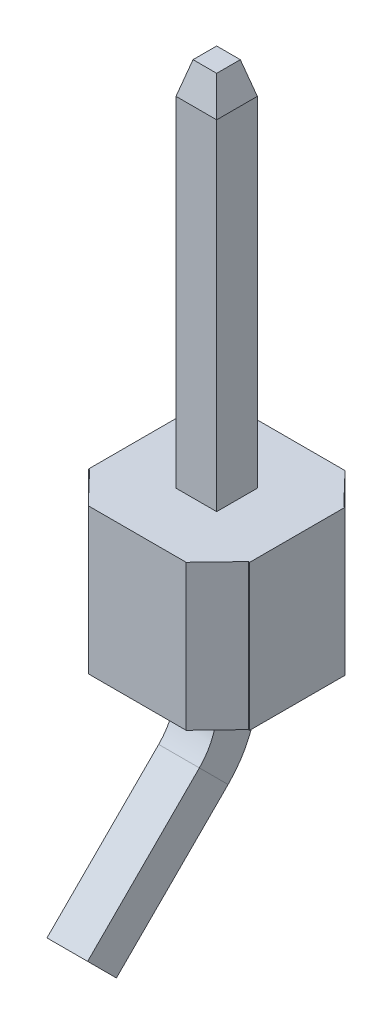
ISO-10303-21;
HEADER;
FILE_DESCRIPTION(('STEP AP214'),'2;1');
FILE_NAME('part.step','',(''),(''),'','','');
FILE_SCHEMA(('AUTOMOTIVE_DESIGN { 1 0 10303 214 1 1 1 1 }'));
ENDSEC;
DATA;
#1=APPLICATION_CONTEXT('core data for automotive mechanical design processes');
#2=APPLICATION_PROTOCOL_DEFINITION('international standard','automotive_design',2000,#1);
#3=PRODUCT_CONTEXT('',#1,'mechanical');
#4=PRODUCT('Part','Part','',(#3));
#5=PRODUCT_RELATED_PRODUCT_CATEGORY('part','',(#4));
#6=PRODUCT_DEFINITION_FORMATION('','',#4);
#7=PRODUCT_DEFINITION_CONTEXT('part definition',#1,'design');
#8=PRODUCT_DEFINITION('design','',#6,#7);
#9=PRODUCT_DEFINITION_SHAPE('','',#8);
#10=(LENGTH_UNIT() NAMED_UNIT(*) SI_UNIT(.MILLI.,.METRE.));
#11=(NAMED_UNIT(*) PLANE_ANGLE_UNIT() SI_UNIT($,.RADIAN.));
#12=(NAMED_UNIT(*) SI_UNIT($,.STERADIAN.) SOLID_ANGLE_UNIT());
#13=UNCERTAINTY_MEASURE_WITH_UNIT(LENGTH_MEASURE(1.E-05),#10,'distance_accuracy_value','');
#14=(GEOMETRIC_REPRESENTATION_CONTEXT(3) GLOBAL_UNCERTAINTY_ASSIGNED_CONTEXT((#13)) GLOBAL_UNIT_ASSIGNED_CONTEXT((#10,
#11,#12)) REPRESENTATION_CONTEXT('',''));
#15=CARTESIAN_POINT('',(0.,0.,0.));
#16=DIRECTION('',(0.,0.,1.));
#17=DIRECTION('',(1.,0.,0.));
#18=AXIS2_PLACEMENT_3D('',#15,#16,#17);
#19=CARTESIAN_POINT('',(0.,2.29,0.));
#20=DIRECTION('',(0.,-1.,0.));
#21=DIRECTION('',(0.,0.,-1.));
#22=AXIS2_PLACEMENT_3D('',#19,#20,#21);
#23=PLANE('',#22);
#24=DIRECTION('',(-0.692531828189713,0.,0.721387321030952));
#25=VECTOR('',#24,1.);
#26=CARTESIAN_POINT('',(-0.770000000000001,2.29,-1.25));
#27=LINE('',#26,#25);
#28=CARTESIAN_POINT('',(-0.770000000000001,2.29,-1.25));
#29=VERTEX_POINT('',#28);
#30=CARTESIAN_POINT('',(-1.25,2.29,-0.749999999999999));
#31=VERTEX_POINT('',#30);
#32=EDGE_CURVE('E313',#29,#31,#27,.T.);
#33=ORIENTED_EDGE('',*,*,#32,.T.);
#34=DIRECTION('',(-1.,0.,0.));
#35=VECTOR('',#34,1.);
#36=CARTESIAN_POINT('',(-1.25,2.29,-0.749999999999999));
#37=LINE('',#36,#35);
#38=CARTESIAN_POINT('',(-1.27,2.29,-0.749999999999999));
#39=VERTEX_POINT('',#38);
#40=EDGE_CURVE('E316',#31,#39,#37,.T.);
#41=ORIENTED_EDGE('',*,*,#40,.T.);
#42=DIRECTION('',(0.,0.,1.));
#43=VECTOR('',#42,1.);
#44=CARTESIAN_POINT('',(-1.27,2.29,0.75));
#45=LINE('',#44,#43);
#46=CARTESIAN_POINT('',(-1.27,2.29,0.75));
#47=VERTEX_POINT('',#46);
#48=EDGE_CURVE('E319',#39,#47,#45,.T.);
#49=ORIENTED_EDGE('',*,*,#48,.T.);
#50=DIRECTION('',(1.,0.,0.));
#51=VECTOR('',#50,1.);
#52=CARTESIAN_POINT('',(-1.25,2.29,0.75));
#53=LINE('',#52,#51);
#54=CARTESIAN_POINT('',(-1.25,2.29,0.75));
#55=VERTEX_POINT('',#54);
#56=EDGE_CURVE('E321',#47,#55,#53,.T.);
#57=ORIENTED_EDGE('',*,*,#56,.T.);
#58=DIRECTION('',(0.692531828189713,0.,0.721387321030951));
#59=VECTOR('',#58,1.);
#60=CARTESIAN_POINT('',(-0.77,2.29,1.25));
#61=LINE('',#60,#59);
#62=CARTESIAN_POINT('',(-0.77,2.29,1.25));
#63=VERTEX_POINT('',#62);
#64=EDGE_CURVE('E323',#55,#63,#61,.T.);
#65=ORIENTED_EDGE('',*,*,#64,.T.);
#66=DIRECTION('',(1.,0.,0.));
#67=VECTOR('',#66,1.);
#68=CARTESIAN_POINT('',(-0.77,2.29,1.25));
#69=LINE('',#68,#67);
#70=CARTESIAN_POINT('',(0.77,2.29,1.25));
#71=VERTEX_POINT('',#70);
#72=EDGE_CURVE('E325',#63,#71,#69,.T.);
#73=ORIENTED_EDGE('',*,*,#72,.T.);
#74=DIRECTION('',(0.692531828189713,0.,-0.721387321030952));
#75=VECTOR('',#74,1.);
#76=CARTESIAN_POINT('',(0.77,2.29,1.25));
#77=LINE('',#76,#75);
#78=CARTESIAN_POINT('',(1.25,2.29,0.749999999999999));
#79=VERTEX_POINT('',#78);
#80=EDGE_CURVE('E327',#71,#79,#77,.T.);
#81=ORIENTED_EDGE('',*,*,#80,.T.);
#82=DIRECTION('',(1.,0.,0.));
#83=VECTOR('',#82,1.);
#84=CARTESIAN_POINT('',(1.25,2.29,0.749999999999999));
#85=LINE('',#84,#83);
#86=CARTESIAN_POINT('',(1.27,2.29,0.749999999999999));
#87=VERTEX_POINT('',#86);
#88=EDGE_CURVE('E329',#79,#87,#85,.T.);
#89=ORIENTED_EDGE('',*,*,#88,.T.);
#90=DIRECTION('',(0.,0.,-1.));
#91=VECTOR('',#90,1.);
#92=CARTESIAN_POINT('',(1.27,2.29,0.749999999999999));
#93=LINE('',#92,#91);
#94=CARTESIAN_POINT('',(1.27,2.29,-0.749999999999999));
#95=VERTEX_POINT('',#94);
#96=EDGE_CURVE('E331',#87,#95,#93,.T.);
#97=ORIENTED_EDGE('',*,*,#96,.T.);
#98=DIRECTION('',(-1.,0.,0.));
#99=VECTOR('',#98,1.);
#100=CARTESIAN_POINT('',(1.25,2.29,-0.749999999999999));
#101=LINE('',#100,#99);
#102=CARTESIAN_POINT('',(1.25,2.29,-0.749999999999999));
#103=VERTEX_POINT('',#102);
#104=EDGE_CURVE('E333',#95,#103,#101,.T.);
#105=ORIENTED_EDGE('',*,*,#104,.T.);
#106=DIRECTION('',(-0.692531828189713,0.,-0.721387321030952));
#107=VECTOR('',#106,1.);
#108=CARTESIAN_POINT('',(0.77,2.29,-1.25));
#109=LINE('',#108,#107);
#110=CARTESIAN_POINT('',(0.77,2.29,-1.25));
#111=VERTEX_POINT('',#110);
#112=EDGE_CURVE('E335',#103,#111,#109,.T.);
#113=ORIENTED_EDGE('',*,*,#112,.T.);
#114=DIRECTION('',(-1.,0.,0.));
#115=VECTOR('',#114,1.);
#116=CARTESIAN_POINT('',(-0.770000000000001,2.29,-1.25));
#117=LINE('',#116,#115);
#118=EDGE_CURVE('E337',#111,#29,#117,.T.);
#119=ORIENTED_EDGE('',*,*,#118,.T.);
#120=EDGE_LOOP('',(#33,#41,#49,#57,#65,#73,#81,#89,#97,#105,#113,#119));
#121=FACE_BOUND('',#120,.T.);
#122=DIRECTION('',(0.,0.,1.));
#123=VECTOR('',#122,1.);
#124=CARTESIAN_POINT('',(-0.32,2.29,0.));
#125=LINE('',#124,#123);
#126=CARTESIAN_POINT('',(-0.32,2.29,-0.320000000000002));
#127=VERTEX_POINT('',#126);
#128=CARTESIAN_POINT('',(-0.32,2.29,0.319999999999999));
#129=VERTEX_POINT('',#128);
#130=EDGE_CURVE('E309',#127,#129,#125,.T.);
#131=ORIENTED_EDGE('',*,*,#130,.F.);
#132=DIRECTION('',(-1.,0.,0.));
#133=VECTOR('',#132,1.);
#134=CARTESIAN_POINT('',(0.,2.29,-0.320000000000002));
#135=LINE('',#134,#133);
#136=CARTESIAN_POINT('',(0.32,2.29,-0.320000000000002));
#137=VERTEX_POINT('',#136);
#138=EDGE_CURVE('E300',#137,#127,#135,.T.);
#139=ORIENTED_EDGE('',*,*,#138,.F.);
#140=DIRECTION('',(0.,0.,-1.));
#141=VECTOR('',#140,1.);
#142=CARTESIAN_POINT('',(0.32,2.29,0.));
#143=LINE('',#142,#141);
#144=CARTESIAN_POINT('',(0.32,2.29,0.32));
#145=VERTEX_POINT('',#144);
#146=EDGE_CURVE('E303',#145,#137,#143,.T.);
#147=ORIENTED_EDGE('',*,*,#146,.F.);
#148=DIRECTION('',(1.,0.,0.));
#149=VECTOR('',#148,1.);
#150=CARTESIAN_POINT('',(0.,2.29,0.319999999999999));
#151=LINE('',#150,#149);
#152=EDGE_CURVE('E306',#129,#145,#151,.T.);
#153=ORIENTED_EDGE('',*,*,#152,.F.);
#154=EDGE_LOOP('',(#131,#139,#147,#153));
#155=FACE_BOUND('',#154,.T.);
#156=ADVANCED_FACE('F37',(#121,#155),#23,.F.);
#157=CARTESIAN_POINT('',(0.,0.,0.));
#158=DIRECTION('',(0.,-1.,0.));
#159=DIRECTION('',(0.,0.,-1.));
#160=AXIS2_PLACEMENT_3D('',#157,#158,#159);
#161=PLANE('',#160);
#162=DIRECTION('',(-0.692531828189713,0.,0.721387321030952));
#163=VECTOR('',#162,1.);
#164=CARTESIAN_POINT('',(-0.770000000000001,0.,-1.25));
#165=LINE('',#164,#163);
#166=CARTESIAN_POINT('',(-0.770000000000001,0.,-1.25));
#167=VERTEX_POINT('',#166);
#168=CARTESIAN_POINT('',(-1.25,0.,-0.749999999999999));
#169=VERTEX_POINT('',#168);
#170=EDGE_CURVE('E312',#167,#169,#165,.T.);
#171=ORIENTED_EDGE('',*,*,#170,.F.);
#172=DIRECTION('',(-1.,0.,0.));
#173=VECTOR('',#172,1.);
#174=CARTESIAN_POINT('',(-0.770000000000001,0.,-1.25));
#175=LINE('',#174,#173);
#176=CARTESIAN_POINT('',(0.77,0.,-1.25));
#177=VERTEX_POINT('',#176);
#178=EDGE_CURVE('E317',#177,#167,#175,.T.);
#179=ORIENTED_EDGE('',*,*,#178,.F.);
#180=DIRECTION('',(-0.692531828189713,0.,-0.721387321030952));
#181=VECTOR('',#180,1.);
#182=CARTESIAN_POINT('',(0.77,0.,-1.25));
#183=LINE('',#182,#181);
#184=CARTESIAN_POINT('',(1.25,0.,-0.749999999999999));
#185=VERTEX_POINT('',#184);
#186=EDGE_CURVE('E360',#185,#177,#183,.T.);
#187=ORIENTED_EDGE('',*,*,#186,.F.);
#188=DIRECTION('',(-1.,0.,0.));
#189=VECTOR('',#188,1.);
#190=CARTESIAN_POINT('',(1.25,0.,-0.749999999999999));
#191=LINE('',#190,#189);
#192=CARTESIAN_POINT('',(1.27,0.,-0.749999999999999));
#193=VERTEX_POINT('',#192);
#194=EDGE_CURVE('E358',#193,#185,#191,.T.);
#195=ORIENTED_EDGE('',*,*,#194,.F.);
#196=DIRECTION('',(0.,0.,-1.));
#197=VECTOR('',#196,1.);
#198=CARTESIAN_POINT('',(1.27,0.,0.749999999999999));
#199=LINE('',#198,#197);
#200=CARTESIAN_POINT('',(1.27,0.,0.749999999999999));
#201=VERTEX_POINT('',#200);
#202=EDGE_CURVE('E356',#201,#193,#199,.T.);
#203=ORIENTED_EDGE('',*,*,#202,.F.);
#204=DIRECTION('',(1.,0.,0.));
#205=VECTOR('',#204,1.);
#206=CARTESIAN_POINT('',(1.25,0.,0.749999999999999));
#207=LINE('',#206,#205);
#208=CARTESIAN_POINT('',(1.25,0.,0.749999999999999));
#209=VERTEX_POINT('',#208);
#210=EDGE_CURVE('E354',#209,#201,#207,.T.);
#211=ORIENTED_EDGE('',*,*,#210,.F.);
#212=DIRECTION('',(0.692531828189713,0.,-0.721387321030952));
#213=VECTOR('',#212,1.);
#214=CARTESIAN_POINT('',(0.77,0.,1.25));
#215=LINE('',#214,#213);
#216=CARTESIAN_POINT('',(0.77,0.,1.25));
#217=VERTEX_POINT('',#216);
#218=EDGE_CURVE('E352',#217,#209,#215,.T.);
#219=ORIENTED_EDGE('',*,*,#218,.F.);
#220=DIRECTION('',(1.,0.,0.));
#221=VECTOR('',#220,1.);
#222=CARTESIAN_POINT('',(-0.77,0.,1.25));
#223=LINE('',#222,#221);
#224=CARTESIAN_POINT('',(-0.77,0.,1.25));
#225=VERTEX_POINT('',#224);
#226=EDGE_CURVE('E350',#225,#217,#223,.T.);
#227=ORIENTED_EDGE('',*,*,#226,.F.);
#228=DIRECTION('',(0.692531828189713,0.,0.721387321030951));
#229=VECTOR('',#228,1.);
#230=CARTESIAN_POINT('',(-0.77,0.,1.25));
#231=LINE('',#230,#229);
#232=CARTESIAN_POINT('',(-1.25,0.,0.75));
#233=VERTEX_POINT('',#232);
#234=EDGE_CURVE('E348',#233,#225,#231,.T.);
#235=ORIENTED_EDGE('',*,*,#234,.F.);
#236=DIRECTION('',(1.,0.,0.));
#237=VECTOR('',#236,1.);
#238=CARTESIAN_POINT('',(-1.25,0.,0.75));
#239=LINE('',#238,#237);
#240=CARTESIAN_POINT('',(-1.27,0.,0.75));
#241=VERTEX_POINT('',#240);
#242=EDGE_CURVE('E346',#241,#233,#239,.T.);
#243=ORIENTED_EDGE('',*,*,#242,.F.);
#244=DIRECTION('',(0.,0.,1.));
#245=VECTOR('',#244,1.);
#246=CARTESIAN_POINT('',(-1.27,0.,0.75));
#247=LINE('',#246,#245);
#248=CARTESIAN_POINT('',(-1.27,0.,-0.749999999999999));
#249=VERTEX_POINT('',#248);
#250=EDGE_CURVE('E344',#249,#241,#247,.T.);
#251=ORIENTED_EDGE('',*,*,#250,.F.);
#252=DIRECTION('',(-1.,0.,0.));
#253=VECTOR('',#252,1.);
#254=CARTESIAN_POINT('',(-1.25,0.,-0.749999999999999));
#255=LINE('',#254,#253);
#256=EDGE_CURVE('E342',#169,#249,#255,.T.);
#257=ORIENTED_EDGE('',*,*,#256,.F.);
#258=EDGE_LOOP('',(#171,#179,#187,#195,#203,#211,#219,#227,#235,#243,#251,#257));
#259=FACE_BOUND('',#258,.T.);
#260=DIRECTION('',(-1.,0.,0.));
#261=VECTOR('',#260,1.);
#262=CARTESIAN_POINT('',(0.,0.,-0.320000000000002));
#263=LINE('',#262,#261);
#264=CARTESIAN_POINT('',(0.32,0.,-0.320000000000002));
#265=VERTEX_POINT('',#264);
#266=CARTESIAN_POINT('',(-0.32,0.,-0.320000000000002));
#267=VERTEX_POINT('',#266);
#268=EDGE_CURVE('E398',#265,#267,#263,.T.);
#269=ORIENTED_EDGE('',*,*,#268,.T.);
#270=DIRECTION('',(0.,0.,1.));
#271=VECTOR('',#270,1.);
#272=CARTESIAN_POINT('',(-0.32,0.,0.));
#273=LINE('',#272,#271);
#274=CARTESIAN_POINT('',(-0.32,0.,0.319999999999998));
#275=VERTEX_POINT('',#274);
#276=EDGE_CURVE('E219',#267,#275,#273,.T.);
#277=ORIENTED_EDGE('',*,*,#276,.T.);
#278=DIRECTION('',(1.,0.,0.));
#279=VECTOR('',#278,1.);
#280=CARTESIAN_POINT('',(0.,0.,0.319999999999998));
#281=LINE('',#280,#279);
#282=CARTESIAN_POINT('',(0.32,0.,0.319999999999998));
#283=VERTEX_POINT('',#282);
#284=EDGE_CURVE('E403',#275,#283,#281,.T.);
#285=ORIENTED_EDGE('',*,*,#284,.T.);
#286=DIRECTION('',(0.,0.,-1.));
#287=VECTOR('',#286,1.);
#288=CARTESIAN_POINT('',(0.32,0.,0.));
#289=LINE('',#288,#287);
#290=EDGE_CURVE('E400',#283,#265,#289,.T.);
#291=ORIENTED_EDGE('',*,*,#290,.T.);
#292=EDGE_LOOP('',(#269,#277,#285,#291));
#293=FACE_BOUND('',#292,.T.);
#294=ADVANCED_FACE('F464',(#259,#293),#161,.T.);
#295=CARTESIAN_POINT('',(-0.770000000000001,2.29,-1.25));
#296=DIRECTION('',(0.721387321030952,0.,0.692531828189713));
#297=DIRECTION('',(0.692531828189713,0.,-0.721387321030952));
#298=AXIS2_PLACEMENT_3D('',#295,#296,#297);
#299=PLANE('',#298);
#300=ORIENTED_EDGE('',*,*,#170,.T.);
#301=DIRECTION('',(0.,-1.,0.));
#302=VECTOR('',#301,1.);
#303=CARTESIAN_POINT('',(-1.25,2.29,-0.749999999999999));
#304=LINE('',#303,#302);
#305=EDGE_CURVE('E395',#31,#169,#304,.T.);
#306=ORIENTED_EDGE('',*,*,#305,.F.);
#307=ORIENTED_EDGE('',*,*,#32,.F.);
#308=DIRECTION('',(0.,-1.,0.));
#309=VECTOR('',#308,1.);
#310=CARTESIAN_POINT('',(-0.770000000000001,2.29,-1.25));
#311=LINE('',#310,#309);
#312=EDGE_CURVE('E339',#29,#167,#311,.T.);
#313=ORIENTED_EDGE('',*,*,#312,.T.);
#314=EDGE_LOOP('',(#300,#306,#307,#313));
#315=FACE_BOUND('',#314,.T.);
#316=ADVANCED_FACE('F469',(#315),#299,.F.);
#317=CARTESIAN_POINT('',(-1.25,2.29,-0.749999999999999));
#318=DIRECTION('',(0.,0.,1.));
#319=DIRECTION('',(1.,0.,0.));
#320=AXIS2_PLACEMENT_3D('',#317,#318,#319);
#321=PLANE('',#320);
#322=ORIENTED_EDGE('',*,*,#256,.T.);
#323=DIRECTION('',(0.,-1.,0.));
#324=VECTOR('',#323,1.);
#325=CARTESIAN_POINT('',(-1.27,2.29,-0.749999999999999));
#326=LINE('',#325,#324);
#327=EDGE_CURVE('E392',#39,#249,#326,.T.);
#328=ORIENTED_EDGE('',*,*,#327,.F.);
#329=ORIENTED_EDGE('',*,*,#40,.F.);
#330=ORIENTED_EDGE('',*,*,#305,.T.);
#331=EDGE_LOOP('',(#322,#328,#329,#330));
#332=FACE_BOUND('',#331,.T.);
#333=ADVANCED_FACE('F514',(#332),#321,.F.);
#334=CARTESIAN_POINT('',(-1.27,2.29,0.75));
#335=DIRECTION('',(1.,0.,0.));
#336=DIRECTION('',(0.,0.,-1.));
#337=AXIS2_PLACEMENT_3D('',#334,#335,#336);
#338=PLANE('',#337);
#339=ORIENTED_EDGE('',*,*,#250,.T.);
#340=DIRECTION('',(0.,-1.,0.));
#341=VECTOR('',#340,1.);
#342=CARTESIAN_POINT('',(-1.27,2.29,0.75));
#343=LINE('',#342,#341);
#344=EDGE_CURVE('E389',#47,#241,#343,.T.);
#345=ORIENTED_EDGE('',*,*,#344,.F.);
#346=ORIENTED_EDGE('',*,*,#48,.F.);
#347=ORIENTED_EDGE('',*,*,#327,.T.);
#348=EDGE_LOOP('',(#339,#345,#346,#347));
#349=FACE_BOUND('',#348,.T.);
#350=ADVANCED_FACE('F510',(#349),#338,.F.);
#351=CARTESIAN_POINT('',(-1.25,2.29,0.75));
#352=DIRECTION('',(0.,0.,-1.));
#353=DIRECTION('',(-1.,0.,0.));
#354=AXIS2_PLACEMENT_3D('',#351,#352,#353);
#355=PLANE('',#354);
#356=ORIENTED_EDGE('',*,*,#242,.T.);
#357=DIRECTION('',(0.,-1.,0.));
#358=VECTOR('',#357,1.);
#359=CARTESIAN_POINT('',(-1.25,2.29,0.75));
#360=LINE('',#359,#358);
#361=EDGE_CURVE('E386',#55,#233,#360,.T.);
#362=ORIENTED_EDGE('',*,*,#361,.F.);
#363=ORIENTED_EDGE('',*,*,#56,.F.);
#364=ORIENTED_EDGE('',*,*,#344,.T.);
#365=EDGE_LOOP('',(#356,#362,#363,#364));
#366=FACE_BOUND('',#365,.T.);
#367=ADVANCED_FACE('F506',(#366),#355,.F.);
#368=CARTESIAN_POINT('',(-0.77,2.29,1.25));
#369=DIRECTION('',(0.721387321030951,0.,-0.692531828189714));
#370=DIRECTION('',(-0.692531828189714,0.,-0.721387321030951));
#371=AXIS2_PLACEMENT_3D('',#368,#369,#370);
#372=PLANE('',#371);
#373=ORIENTED_EDGE('',*,*,#234,.T.);
#374=DIRECTION('',(0.,-1.,0.));
#375=VECTOR('',#374,1.);
#376=CARTESIAN_POINT('',(-0.77,2.29,1.25));
#377=LINE('',#376,#375);
#378=EDGE_CURVE('E383',#63,#225,#377,.T.);
#379=ORIENTED_EDGE('',*,*,#378,.F.);
#380=ORIENTED_EDGE('',*,*,#64,.F.);
#381=ORIENTED_EDGE('',*,*,#361,.T.);
#382=EDGE_LOOP('',(#373,#379,#380,#381));
#383=FACE_BOUND('',#382,.T.);
#384=ADVANCED_FACE('F502',(#383),#372,.F.);
#385=CARTESIAN_POINT('',(-0.77,2.29,1.25));
#386=DIRECTION('',(0.,0.,-1.));
#387=DIRECTION('',(-1.,0.,0.));
#388=AXIS2_PLACEMENT_3D('',#385,#386,#387);
#389=PLANE('',#388);
#390=ORIENTED_EDGE('',*,*,#226,.T.);
#391=DIRECTION('',(0.,-1.,0.));
#392=VECTOR('',#391,1.);
#393=CARTESIAN_POINT('',(0.77,2.29,1.25));
#394=LINE('',#393,#392);
#395=EDGE_CURVE('E380',#71,#217,#394,.T.);
#396=ORIENTED_EDGE('',*,*,#395,.F.);
#397=ORIENTED_EDGE('',*,*,#72,.F.);
#398=ORIENTED_EDGE('',*,*,#378,.T.);
#399=EDGE_LOOP('',(#390,#396,#397,#398));
#400=FACE_BOUND('',#399,.T.);
#401=ADVANCED_FACE('F498',(#400),#389,.F.);
#402=CARTESIAN_POINT('',(0.77,2.29,1.25));
#403=DIRECTION('',(-0.721387321030952,0.,-0.692531828189713));
#404=DIRECTION('',(-0.692531828189713,0.,0.721387321030952));
#405=AXIS2_PLACEMENT_3D('',#402,#403,#404);
#406=PLANE('',#405);
#407=ORIENTED_EDGE('',*,*,#218,.T.);
#408=DIRECTION('',(0.,-1.,0.));
#409=VECTOR('',#408,1.);
#410=CARTESIAN_POINT('',(1.25,2.29,0.749999999999999));
#411=LINE('',#410,#409);
#412=EDGE_CURVE('E377',#79,#209,#411,.T.);
#413=ORIENTED_EDGE('',*,*,#412,.F.);
#414=ORIENTED_EDGE('',*,*,#80,.F.);
#415=ORIENTED_EDGE('',*,*,#395,.T.);
#416=EDGE_LOOP('',(#407,#413,#414,#415));
#417=FACE_BOUND('',#416,.T.);
#418=ADVANCED_FACE('F494',(#417),#406,.F.);
#419=CARTESIAN_POINT('',(1.25,2.29,0.749999999999999));
#420=DIRECTION('',(0.,0.,-1.));
#421=DIRECTION('',(-1.,0.,0.));
#422=AXIS2_PLACEMENT_3D('',#419,#420,#421);
#423=PLANE('',#422);
#424=ORIENTED_EDGE('',*,*,#210,.T.);
#425=DIRECTION('',(0.,-1.,0.));
#426=VECTOR('',#425,1.);
#427=CARTESIAN_POINT('',(1.27,2.29,0.749999999999999));
#428=LINE('',#427,#426);
#429=EDGE_CURVE('E374',#87,#201,#428,.T.);
#430=ORIENTED_EDGE('',*,*,#429,.F.);
#431=ORIENTED_EDGE('',*,*,#88,.F.);
#432=ORIENTED_EDGE('',*,*,#412,.T.);
#433=EDGE_LOOP('',(#424,#430,#431,#432));
#434=FACE_BOUND('',#433,.T.);
#435=ADVANCED_FACE('F490',(#434),#423,.F.);
#436=CARTESIAN_POINT('',(1.27,2.29,0.749999999999999));
#437=DIRECTION('',(-1.,0.,0.));
#438=DIRECTION('',(0.,0.,1.));
#439=AXIS2_PLACEMENT_3D('',#436,#437,#438);
#440=PLANE('',#439);
#441=ORIENTED_EDGE('',*,*,#202,.T.);
#442=DIRECTION('',(0.,-1.,0.));
#443=VECTOR('',#442,1.);
#444=CARTESIAN_POINT('',(1.27,2.29,-0.749999999999999));
#445=LINE('',#444,#443);
#446=EDGE_CURVE('E371',#95,#193,#445,.T.);
#447=ORIENTED_EDGE('',*,*,#446,.F.);
#448=ORIENTED_EDGE('',*,*,#96,.F.);
#449=ORIENTED_EDGE('',*,*,#429,.T.);
#450=EDGE_LOOP('',(#441,#447,#448,#449));
#451=FACE_BOUND('',#450,.T.);
#452=ADVANCED_FACE('F486',(#451),#440,.F.);
#453=CARTESIAN_POINT('',(1.25,2.29,-0.749999999999999));
#454=DIRECTION('',(0.,0.,1.));
#455=DIRECTION('',(1.,0.,0.));
#456=AXIS2_PLACEMENT_3D('',#453,#454,#455);
#457=PLANE('',#456);
#458=ORIENTED_EDGE('',*,*,#194,.T.);
#459=DIRECTION('',(0.,-1.,0.));
#460=VECTOR('',#459,1.);
#461=CARTESIAN_POINT('',(1.25,2.29,-0.749999999999999));
#462=LINE('',#461,#460);
#463=EDGE_CURVE('E368',#103,#185,#462,.T.);
#464=ORIENTED_EDGE('',*,*,#463,.F.);
#465=ORIENTED_EDGE('',*,*,#104,.F.);
#466=ORIENTED_EDGE('',*,*,#446,.T.);
#467=EDGE_LOOP('',(#458,#464,#465,#466));
#468=FACE_BOUND('',#467,.T.);
#469=ADVANCED_FACE('F482',(#468),#457,.F.);
#470=CARTESIAN_POINT('',(0.77,2.29,-1.25));
#471=DIRECTION('',(-0.721387321030952,0.,0.692531828189713));
#472=DIRECTION('',(0.692531828189713,0.,0.721387321030952));
#473=AXIS2_PLACEMENT_3D('',#470,#471,#472);
#474=PLANE('',#473);
#475=ORIENTED_EDGE('',*,*,#186,.T.);
#476=DIRECTION('',(0.,-1.,0.));
#477=VECTOR('',#476,1.);
#478=CARTESIAN_POINT('',(0.77,2.29,-1.25));
#479=LINE('',#478,#477);
#480=EDGE_CURVE('E365',#111,#177,#479,.T.);
#481=ORIENTED_EDGE('',*,*,#480,.F.);
#482=ORIENTED_EDGE('',*,*,#112,.F.);
#483=ORIENTED_EDGE('',*,*,#463,.T.);
#484=EDGE_LOOP('',(#475,#481,#482,#483));
#485=FACE_BOUND('',#484,.T.);
#486=ADVANCED_FACE('F478',(#485),#474,.F.);
#487=CARTESIAN_POINT('',(-0.770000000000001,2.29,-1.25));
#488=DIRECTION('',(0.,0.,1.));
#489=DIRECTION('',(1.,0.,0.));
#490=AXIS2_PLACEMENT_3D('',#487,#488,#489);
#491=PLANE('',#490);
#492=ORIENTED_EDGE('',*,*,#178,.T.);
#493=ORIENTED_EDGE('',*,*,#312,.F.);
#494=ORIENTED_EDGE('',*,*,#118,.F.);
#495=ORIENTED_EDGE('',*,*,#480,.T.);
#496=EDGE_LOOP('',(#492,#493,#494,#495));
#497=FACE_BOUND('',#496,.T.);
#498=ADVANCED_FACE('F474',(#497),#491,.F.);
#499=CARTESIAN_POINT('',(-0.32,-1.51829988167568,0.139842353537122));
#500=DIRECTION('',(0.,0.707106781186548,0.707106781186546));
#501=DIRECTION('',(0.,-0.707106781186547,0.707106781186549));
#502=AXIS2_PLACEMENT_3D('',#499,#500,#501);
#503=PLANE('',#502);
#504=DIRECTION('',(-1.,0.,0.));
#505=VECTOR('',#504,1.);
#506=CARTESIAN_POINT('',(-0.32,-3.2762741699797,1.89781664184114));
#507=LINE('',#506,#505);
#508=CARTESIAN_POINT('',(0.32,-3.2762741699797,1.89781664184114));
#509=VERTEX_POINT('',#508);
#510=CARTESIAN_POINT('',(-0.32,-3.2762741699797,1.89781664184114));
#511=VERTEX_POINT('',#510);
#512=EDGE_CURVE('E296',#509,#511,#507,.T.);
#513=ORIENTED_EDGE('',*,*,#512,.T.);
#514=DIRECTION('',(0.,-0.707106781186546,0.707106781186548));
#515=VECTOR('',#514,1.);
#516=CARTESIAN_POINT('',(-0.32,-1.51829988167568,0.139842353537122));
#517=LINE('',#516,#515);
#518=CARTESIAN_POINT('',(-0.32,-1.51829988167572,0.139842353537083));
#519=VERTEX_POINT('',#518);
#520=EDGE_CURVE('E264',#519,#511,#517,.T.);
#521=ORIENTED_EDGE('',*,*,#520,.F.);
#522=DIRECTION('',(-1.,0.,0.));
#523=VECTOR('',#522,1.);
#524=CARTESIAN_POINT('',(-0.32,-1.51829988167568,0.139842353537121));
#525=LINE('',#524,#523);
#526=CARTESIAN_POINT('',(0.32,-1.51829988167572,0.139842353537083));
#527=VERTEX_POINT('',#526);
#528=EDGE_CURVE('E235',#527,#519,#525,.T.);
#529=ORIENTED_EDGE('',*,*,#528,.F.);
#530=DIRECTION('',(0.,-0.707106781186546,0.707106781186548));
#531=VECTOR('',#530,1.);
#532=CARTESIAN_POINT('',(0.32,-1.51829988167568,0.139842353537122));
#533=LINE('',#532,#531);
#534=EDGE_CURVE('E294',#527,#509,#533,.T.);
#535=ORIENTED_EDGE('',*,*,#534,.T.);
#536=EDGE_LOOP('',(#513,#521,#529,#535));
#537=FACE_BOUND('',#536,.T.);
#538=ADVANCED_FACE('F477',(#537),#503,.F.);
#539=CARTESIAN_POINT('',(0.32,-1.51829988167568,0.139842353537122));
#540=DIRECTION('',(-1.,0.,0.));
#541=DIRECTION('',(0.,-1.,0.));
#542=AXIS2_PLACEMENT_3D('',#539,#540,#541);
#543=PLANE('',#542);
#544=ORIENTED_EDGE('',*,*,#534,.F.);
#545=DIRECTION('',(0.,-0.707106781186549,-0.707106781186546));
#546=VECTOR('',#545,1.);
#547=CARTESIAN_POINT('',(0.32,-1.51829988167568,0.139842353537121));
#548=LINE('',#547,#546);
#549=CARTESIAN_POINT('',(0.32,-1.06575154171633,0.592390693496473));
#550=VERTEX_POINT('',#549);
#551=EDGE_CURVE('E281',#550,#527,#548,.T.);
#552=ORIENTED_EDGE('',*,*,#551,.F.);
#553=DIRECTION('',(0.,-0.707106781186546,0.707106781186548));
#554=VECTOR('',#553,1.);
#555=CARTESIAN_POINT('',(0.32,-1.06575154171629,0.592390693496511));
#556=LINE('',#555,#554);
#557=CARTESIAN_POINT('',(0.32,-2.8237258300203,2.35036498180053));
#558=VERTEX_POINT('',#557);
#559=EDGE_CURVE('E283',#550,#558,#556,.T.);
#560=ORIENTED_EDGE('',*,*,#559,.T.);
#561=DIRECTION('',(0.,-0.707106781186549,-0.707106781186546));
#562=VECTOR('',#561,1.);
#563=CARTESIAN_POINT('',(0.32,-3.2762741699797,1.89781664184114));
#564=LINE('',#563,#562);
#565=EDGE_CURVE('E286',#558,#509,#564,.T.);
#566=ORIENTED_EDGE('',*,*,#565,.T.);
#567=EDGE_LOOP('',(#544,#552,#560,#566));
#568=FACE_BOUND('',#567,.T.);
#569=ADVANCED_FACE('F674',(#568),#543,.F.);
#570=CARTESIAN_POINT('',(-0.32,-1.06575154171629,0.592390693496511));
#571=DIRECTION('',(0.,-0.707106781186548,-0.707106781186546));
#572=DIRECTION('',(0.,0.707106781186547,-0.707106781186549));
#573=AXIS2_PLACEMENT_3D('',#570,#571,#572);
#574=PLANE('',#573);
#575=ORIENTED_EDGE('',*,*,#559,.F.);
#576=DIRECTION('',(1.,0.,0.));
#577=VECTOR('',#576,1.);
#578=CARTESIAN_POINT('',(-0.32,-1.06575154171629,0.59239069349651));
#579=LINE('',#578,#577);
#580=CARTESIAN_POINT('',(-0.32,-1.06575154171633,0.592390693496473));
#581=VERTEX_POINT('',#580);
#582=EDGE_CURVE('E259',#581,#550,#579,.T.);
#583=ORIENTED_EDGE('',*,*,#582,.F.);
#584=DIRECTION('',(0.,-0.707106781186546,0.707106781186548));
#585=VECTOR('',#584,1.);
#586=CARTESIAN_POINT('',(-0.32,-1.06575154171629,0.592390693496511));
#587=LINE('',#586,#585);
#588=CARTESIAN_POINT('',(-0.32,-2.8237258300203,2.35036498180053));
#589=VERTEX_POINT('',#588);
#590=EDGE_CURVE('E263',#581,#589,#587,.T.);
#591=ORIENTED_EDGE('',*,*,#590,.T.);
#592=DIRECTION('',(1.,0.,0.));
#593=VECTOR('',#592,1.);
#594=CARTESIAN_POINT('',(-0.32,-2.8237258300203,2.35036498180053));
#595=LINE('',#594,#593);
#596=EDGE_CURVE('E267',#589,#558,#595,.T.);
#597=ORIENTED_EDGE('',*,*,#596,.T.);
#598=EDGE_LOOP('',(#575,#583,#591,#597));
#599=FACE_BOUND('',#598,.T.);
#600=ADVANCED_FACE('F665',(#599),#574,.F.);
#601=CARTESIAN_POINT('',(-0.32,-1.51829988167568,0.139842353537122));
#602=DIRECTION('',(1.,0.,0.));
#603=DIRECTION('',(0.,1.,0.));
#604=AXIS2_PLACEMENT_3D('',#601,#602,#603);
#605=PLANE('',#604);
#606=ORIENTED_EDGE('',*,*,#590,.F.);
#607=DIRECTION('',(0.,0.707106781186549,0.707106781186546));
#608=VECTOR('',#607,1.);
#609=CARTESIAN_POINT('',(-0.32,-1.51829988167568,0.139842353537121));
#610=LINE('',#609,#608);
#611=EDGE_CURVE('E239',#519,#581,#610,.T.);
#612=ORIENTED_EDGE('',*,*,#611,.F.);
#613=ORIENTED_EDGE('',*,*,#520,.T.);
#614=DIRECTION('',(0.,0.707106781186549,0.707106781186546));
#615=VECTOR('',#614,1.);
#616=CARTESIAN_POINT('',(-0.32,-3.2762741699797,1.89781664184114));
#617=LINE('',#616,#615);
#618=EDGE_CURVE('E261',#511,#589,#617,.T.);
#619=ORIENTED_EDGE('',*,*,#618,.T.);
#620=EDGE_LOOP('',(#606,#612,#613,#619));
#621=FACE_BOUND('',#620,.T.);
#622=ADVANCED_FACE('F657',(#621),#605,.F.);
#623=CARTESIAN_POINT('',(0.,-0.4081422352128,1.25));
#624=DIRECTION('',(-1.,0.,0.));
#625=DIRECTION('',(0.,0.,1.));
#626=AXIS2_PLACEMENT_3D('',#623,#624,#625);
#627=CYLINDRICAL_SURFACE('',#626,1.57000000000005);
#628=ORIENTED_EDGE('',*,*,#528,.T.);
#629=CARTESIAN_POINT('',(-0.32,-0.4081422352128,1.25));
#630=DIRECTION('',(-1.,0.,0.));
#631=DIRECTION('',(0.,0.,-1.));
#632=AXIS2_PLACEMENT_3D('',#629,#630,#631);
#633=CIRCLE('',#632,1.57000000000005);
#634=CARTESIAN_POINT('',(-0.32,-0.408142235212792,-0.320000000000002));
#635=VERTEX_POINT('',#634);
#636=EDGE_CURVE('E229',#635,#519,#633,.T.);
#637=ORIENTED_EDGE('',*,*,#636,.F.);
#638=DIRECTION('',(-1.,0.,0.));
#639=VECTOR('',#638,1.);
#640=CARTESIAN_POINT('',(-0.32,-0.408142235212792,-0.320000000000002));
#641=LINE('',#640,#639);
#642=CARTESIAN_POINT('',(0.32,-0.408142235212792,-0.320000000000002));
#643=VERTEX_POINT('',#642);
#644=EDGE_CURVE('E232',#643,#635,#641,.T.);
#645=ORIENTED_EDGE('',*,*,#644,.F.);
#646=CARTESIAN_POINT('',(0.32,-0.4081422352128,1.25));
#647=DIRECTION('',(-1.,0.,0.));
#648=DIRECTION('',(0.,0.,-1.));
#649=AXIS2_PLACEMENT_3D('',#646,#647,#648);
#650=CIRCLE('',#649,1.57000000000005);
#651=EDGE_CURVE('E291',#643,#527,#650,.T.);
#652=ORIENTED_EDGE('',*,*,#651,.T.);
#653=EDGE_LOOP('',(#628,#637,#645,#652));
#654=FACE_BOUND('',#653,.T.);
#655=ADVANCED_FACE('F230',(#654),#627,.T.);
#656=CARTESIAN_POINT('',(0.32,-0.40814223521279,-0.320000000000054));
#657=DIRECTION('',(-1.,0.,0.));
#658=DIRECTION('',(0.,0.,1.));
#659=AXIS2_PLACEMENT_3D('',#656,#657,#658);
#660=PLANE('',#659);
#661=ORIENTED_EDGE('',*,*,#651,.F.);
#662=DIRECTION('',(0.,0.,-1.));
#663=VECTOR('',#662,1.);
#664=CARTESIAN_POINT('',(0.32,-0.408142235212792,-0.320000000000002));
#665=LINE('',#664,#663);
#666=CARTESIAN_POINT('',(0.32,-0.408142235212792,0.319999999999998));
#667=VERTEX_POINT('',#666);
#668=EDGE_CURVE('E275',#667,#643,#665,.T.);
#669=ORIENTED_EDGE('',*,*,#668,.F.);
#670=CARTESIAN_POINT('',(0.32,-0.4081422352128,1.25));
#671=DIRECTION('',(-1.,0.,0.));
#672=DIRECTION('',(0.,0.,-1.));
#673=AXIS2_PLACEMENT_3D('',#670,#671,#672);
#674=CIRCLE('',#673,0.930000000000054);
#675=EDGE_CURVE('E278',#667,#550,#674,.T.);
#676=ORIENTED_EDGE('',*,*,#675,.T.);
#677=ORIENTED_EDGE('',*,*,#551,.T.);
#678=EDGE_LOOP('',(#661,#669,#676,#677));
#679=FACE_BOUND('',#678,.T.);
#680=ADVANCED_FACE('F640',(#679),#660,.F.);
#681=CARTESIAN_POINT('',(0.,-0.4081422352128,1.25));
#682=DIRECTION('',(-1.,0.,0.));
#683=DIRECTION('',(0.,0.,1.));
#684=AXIS2_PLACEMENT_3D('',#681,#682,#683);
#685=CYLINDRICAL_SURFACE('',#684,0.930000000000054);
#686=ORIENTED_EDGE('',*,*,#675,.F.);
#687=DIRECTION('',(1.,0.,0.));
#688=VECTOR('',#687,1.);
#689=CARTESIAN_POINT('',(-0.32,-0.408142235212792,0.319999999999998));
#690=LINE('',#689,#688);
#691=CARTESIAN_POINT('',(-0.32,-0.408142235212792,0.319999999999998));
#692=VERTEX_POINT('',#691);
#693=EDGE_CURVE('E256',#692,#667,#690,.T.);
#694=ORIENTED_EDGE('',*,*,#693,.F.);
#695=CARTESIAN_POINT('',(-0.32,-0.4081422352128,1.25));
#696=DIRECTION('',(-1.,0.,0.));
#697=DIRECTION('',(0.,0.,-1.));
#698=AXIS2_PLACEMENT_3D('',#695,#696,#697);
#699=CIRCLE('',#698,0.930000000000054);
#700=EDGE_CURVE('E250',#692,#581,#699,.T.);
#701=ORIENTED_EDGE('',*,*,#700,.T.);
#702=ORIENTED_EDGE('',*,*,#582,.T.);
#703=EDGE_LOOP('',(#686,#694,#701,#702));
#704=FACE_BOUND('',#703,.T.);
#705=ADVANCED_FACE('F632',(#704),#685,.F.);
#706=CARTESIAN_POINT('',(-0.32,-0.40814223521279,-0.320000000000054));
#707=DIRECTION('',(1.,0.,0.));
#708=DIRECTION('',(0.,0.,-1.));
#709=AXIS2_PLACEMENT_3D('',#706,#707,#708);
#710=PLANE('',#709);
#711=ORIENTED_EDGE('',*,*,#700,.F.);
#712=DIRECTION('',(0.,0.,1.));
#713=VECTOR('',#712,1.);
#714=CARTESIAN_POINT('',(-0.32,-0.408142235212792,-0.320000000000002));
#715=LINE('',#714,#713);
#716=EDGE_CURVE('E217',#635,#692,#715,.T.);
#717=ORIENTED_EDGE('',*,*,#716,.F.);
#718=ORIENTED_EDGE('',*,*,#636,.T.);
#719=ORIENTED_EDGE('',*,*,#611,.T.);
#720=EDGE_LOOP('',(#711,#717,#718,#719));
#721=FACE_BOUND('',#720,.T.);
#722=ADVANCED_FACE('F248',(#721),#710,.F.);
#723=CARTESIAN_POINT('',(-0.32,8.13,-0.32));
#724=DIRECTION('',(0.,0.,1.));
#725=DIRECTION('',(0.,-1.,0.));
#726=AXIS2_PLACEMENT_3D('',#723,#724,#725);
#727=PLANE('',#726);
#728=ORIENTED_EDGE('',*,*,#268,.F.);
#729=DIRECTION('',(0.,-1.,0.));
#730=VECTOR('',#729,1.);
#731=CARTESIAN_POINT('',(0.32,8.13,-0.32));
#732=LINE('',#731,#730);
#733=EDGE_CURVE('E243',#265,#643,#732,.T.);
#734=ORIENTED_EDGE('',*,*,#733,.T.);
#735=ORIENTED_EDGE('',*,*,#644,.T.);
#736=DIRECTION('',(0.,-1.,0.));
#737=VECTOR('',#736,1.);
#738=CARTESIAN_POINT('',(-0.32,8.13,-0.32));
#739=LINE('',#738,#737);
#740=EDGE_CURVE('E212',#267,#635,#739,.T.);
#741=ORIENTED_EDGE('',*,*,#740,.F.);
#742=EDGE_LOOP('',(#728,#734,#735,#741));
#743=FACE_BOUND('',#742,.T.);
#744=ADVANCED_FACE('F241',(#743),#727,.F.);
#745=CARTESIAN_POINT('',(0.32,8.13,-0.32));
#746=DIRECTION('',(-1.,0.,0.));
#747=DIRECTION('',(0.,0.,1.));
#748=AXIS2_PLACEMENT_3D('',#745,#746,#747);
#749=PLANE('',#748);
#750=ORIENTED_EDGE('',*,*,#290,.F.);
#751=DIRECTION('',(0.,-1.,0.));
#752=VECTOR('',#751,1.);
#753=CARTESIAN_POINT('',(0.32,8.13,0.32));
#754=LINE('',#753,#752);
#755=EDGE_CURVE('E272',#283,#667,#754,.T.);
#756=ORIENTED_EDGE('',*,*,#755,.T.);
#757=ORIENTED_EDGE('',*,*,#668,.T.);
#758=ORIENTED_EDGE('',*,*,#733,.F.);
#759=EDGE_LOOP('',(#750,#756,#757,#758));
#760=FACE_BOUND('',#759,.T.);
#761=ADVANCED_FACE('F575',(#760),#749,.F.);
#762=CARTESIAN_POINT('',(-0.32,8.13,0.32));
#763=DIRECTION('',(0.,0.,-1.));
#764=DIRECTION('',(0.,1.,0.));
#765=AXIS2_PLACEMENT_3D('',#762,#763,#764);
#766=PLANE('',#765);
#767=ORIENTED_EDGE('',*,*,#284,.F.);
#768=DIRECTION('',(0.,-1.,0.));
#769=VECTOR('',#768,1.);
#770=CARTESIAN_POINT('',(-0.32,8.13,0.32));
#771=LINE('',#770,#769);
#772=EDGE_CURVE('E252',#275,#692,#771,.T.);
#773=ORIENTED_EDGE('',*,*,#772,.T.);
#774=ORIENTED_EDGE('',*,*,#693,.T.);
#775=ORIENTED_EDGE('',*,*,#755,.F.);
#776=EDGE_LOOP('',(#767,#773,#774,#775));
#777=FACE_BOUND('',#776,.T.);
#778=ADVANCED_FACE('F584',(#777),#766,.F.);
#779=CARTESIAN_POINT('',(-0.32,8.13,-0.32));
#780=DIRECTION('',(1.,0.,0.));
#781=DIRECTION('',(0.,0.,-1.));
#782=AXIS2_PLACEMENT_3D('',#779,#780,#781);
#783=PLANE('',#782);
#784=ORIENTED_EDGE('',*,*,#276,.F.);
#785=ORIENTED_EDGE('',*,*,#740,.T.);
#786=ORIENTED_EDGE('',*,*,#716,.T.);
#787=ORIENTED_EDGE('',*,*,#772,.F.);
#788=EDGE_LOOP('',(#784,#785,#786,#787));
#789=FACE_BOUND('',#788,.T.);
#790=ADVANCED_FACE('F214',(#789),#783,.F.);
#791=CARTESIAN_POINT('',(0.,-3.05,2.12409081182083));
#792=DIRECTION('',(0.,0.707106781186546,-0.707106781186549));
#793=DIRECTION('',(0.,0.707106781186549,0.707106781186546));
#794=AXIS2_PLACEMENT_3D('',#791,#792,#793);
#795=PLANE('',#794);
#796=ORIENTED_EDGE('',*,*,#565,.F.);
#797=ORIENTED_EDGE('',*,*,#596,.F.);
#798=ORIENTED_EDGE('',*,*,#618,.F.);
#799=ORIENTED_EDGE('',*,*,#512,.F.);
#800=EDGE_LOOP('',(#796,#797,#798,#799));
#801=FACE_BOUND('',#800,.T.);
#802=ADVANCED_FACE('F591',(#801),#795,.F.);
#803=CARTESIAN_POINT('',(-0.32,7.63,0.32));
#804=VERTEX_POINT('',#803);
#805=EDGE_CURVE('E254',#804,#129,#771,.T.);
#806=ORIENTED_EDGE('',*,*,#805,.F.);
#807=DIRECTION('',(0.,0.,-1.));
#808=VECTOR('',#807,1.);
#809=CARTESIAN_POINT('',(-0.32,7.63,-0.32));
#810=LINE('',#809,#808);
#811=CARTESIAN_POINT('',(-0.32,7.63,-0.32));
#812=VERTEX_POINT('',#811);
#813=EDGE_CURVE('E62',#804,#812,#810,.T.);
#814=ORIENTED_EDGE('',*,*,#813,.T.);
#815=EDGE_CURVE('E223',#812,#127,#739,.T.);
#816=ORIENTED_EDGE('',*,*,#815,.T.);
#817=ORIENTED_EDGE('',*,*,#130,.T.);
#818=EDGE_LOOP('',(#806,#814,#816,#817));
#819=FACE_BOUND('',#818,.T.);
#820=ADVANCED_FACE('F582',(#819),#783,.F.);
#821=CARTESIAN_POINT('',(0.32,7.63,0.32));
#822=VERTEX_POINT('',#821);
#823=EDGE_CURVE('E273',#822,#145,#754,.T.);
#824=ORIENTED_EDGE('',*,*,#823,.F.);
#825=DIRECTION('',(-1.,0.,0.));
#826=VECTOR('',#825,1.);
#827=CARTESIAN_POINT('',(-0.32,7.63,0.32));
#828=LINE('',#827,#826);
#829=EDGE_CURVE('E416',#822,#804,#828,.T.);
#830=ORIENTED_EDGE('',*,*,#829,.T.);
#831=ORIENTED_EDGE('',*,*,#805,.T.);
#832=ORIENTED_EDGE('',*,*,#152,.T.);
#833=EDGE_LOOP('',(#824,#830,#831,#832));
#834=FACE_BOUND('',#833,.T.);
#835=ADVANCED_FACE('F446',(#834),#766,.F.);
#836=CARTESIAN_POINT('',(0.32,7.63,-0.32));
#837=VERTEX_POINT('',#836);
#838=EDGE_CURVE('E245',#837,#137,#732,.T.);
#839=ORIENTED_EDGE('',*,*,#838,.F.);
#840=DIRECTION('',(0.,0.,1.));
#841=VECTOR('',#840,1.);
#842=CARTESIAN_POINT('',(0.32,7.63,0.32));
#843=LINE('',#842,#841);
#844=EDGE_CURVE('E11',#837,#822,#843,.T.);
#845=ORIENTED_EDGE('',*,*,#844,.T.);
#846=ORIENTED_EDGE('',*,*,#823,.T.);
#847=ORIENTED_EDGE('',*,*,#146,.T.);
#848=EDGE_LOOP('',(#839,#845,#846,#847));
#849=FACE_BOUND('',#848,.T.);
#850=ADVANCED_FACE('F442',(#849),#749,.F.);
#851=ORIENTED_EDGE('',*,*,#815,.F.);
#852=DIRECTION('',(1.,0.,0.));
#853=VECTOR('',#852,1.);
#854=CARTESIAN_POINT('',(0.32,7.63,-0.32));
#855=LINE('',#854,#853);
#856=EDGE_CURVE('E47',#812,#837,#855,.T.);
#857=ORIENTED_EDGE('',*,*,#856,.T.);
#858=ORIENTED_EDGE('',*,*,#838,.T.);
#859=ORIENTED_EDGE('',*,*,#138,.T.);
#860=EDGE_LOOP('',(#851,#857,#858,#859));
#861=FACE_BOUND('',#860,.T.);
#862=ADVANCED_FACE('F454',(#861),#727,.F.);
#863=CARTESIAN_POINT('',(0.,8.13,0.));
#864=DIRECTION('',(0.,1.,0.));
#865=DIRECTION('',(0.,0.,1.));
#866=AXIS2_PLACEMENT_3D('',#863,#864,#865);
#867=PLANE('',#866);
#868=DIRECTION('',(0.,0.,1.));
#869=VECTOR('',#868,1.);
#870=CARTESIAN_POINT('',(-0.186025403784439,8.13,0.32));
#871=LINE('',#870,#869);
#872=CARTESIAN_POINT('',(-0.186025403784439,8.13,-0.186025403784439));
#873=VERTEX_POINT('',#872);
#874=CARTESIAN_POINT('',(-0.186025403784439,8.13,0.186025403784439));
#875=VERTEX_POINT('',#874);
#876=EDGE_CURVE('E411',#873,#875,#871,.T.);
#877=ORIENTED_EDGE('',*,*,#876,.T.);
#878=DIRECTION('',(1.,0.,0.));
#879=VECTOR('',#878,1.);
#880=CARTESIAN_POINT('',(0.32,8.13,0.186025403784439));
#881=LINE('',#880,#879);
#882=CARTESIAN_POINT('',(0.186025403784439,8.13,0.186025403784439));
#883=VERTEX_POINT('',#882);
#884=EDGE_CURVE('E413',#875,#883,#881,.T.);
#885=ORIENTED_EDGE('',*,*,#884,.T.);
#886=DIRECTION('',(0.,0.,-1.));
#887=VECTOR('',#886,1.);
#888=CARTESIAN_POINT('',(0.186025403784439,8.13,-0.32));
#889=LINE('',#888,#887);
#890=CARTESIAN_POINT('',(0.186025403784439,8.13,-0.186025403784439));
#891=VERTEX_POINT('',#890);
#892=EDGE_CURVE('E407',#883,#891,#889,.T.);
#893=ORIENTED_EDGE('',*,*,#892,.T.);
#894=DIRECTION('',(-1.,0.,0.));
#895=VECTOR('',#894,1.);
#896=CARTESIAN_POINT('',(-0.32,8.13,-0.186025403784439));
#897=LINE('',#896,#895);
#898=EDGE_CURVE('E409',#891,#873,#897,.T.);
#899=ORIENTED_EDGE('',*,*,#898,.T.);
#900=EDGE_LOOP('',(#877,#885,#893,#899));
#901=FACE_BOUND('',#900,.T.);
#902=ADVANCED_FACE('F452',(#901),#867,.T.);
#903=CARTESIAN_POINT('',(0.,8.13,-0.186025403784439));
#904=DIRECTION('',(0.,0.258819045102518,-0.965925826289069));
#905=DIRECTION('',(1.,0.,0.));
#906=AXIS2_PLACEMENT_3D('',#903,#904,#905);
#907=PLANE('',#906);
#908=DIRECTION('',(-0.250562807085729,0.935113126531031,0.250562807085729));
#909=VECTOR('',#908,1.);
#910=CARTESIAN_POINT('',(0.174346408916339,8.17358660222908,-0.174346408916339));
#911=LINE('',#910,#909);
#912=EDGE_CURVE('E424',#837,#891,#911,.T.);
#913=ORIENTED_EDGE('',*,*,#912,.F.);
#914=ORIENTED_EDGE('',*,*,#856,.F.);
#915=DIRECTION('',(0.25056280708573,0.935113126531031,0.250562807085729));
#916=VECTOR('',#915,1.);
#917=CARTESIAN_POINT('',(-0.174346408916339,8.17358660222908,-0.174346408916339));
#918=LINE('',#917,#916);
#919=EDGE_CURVE('E42',#873,#812,#918,.F.);
#920=ORIENTED_EDGE('',*,*,#919,.F.);
#921=ORIENTED_EDGE('',*,*,#898,.F.);
#922=EDGE_LOOP('',(#913,#914,#920,#921));
#923=FACE_BOUND('',#922,.T.);
#924=ADVANCED_FACE('F40',(#923),#907,.T.);
#925=CARTESIAN_POINT('',(-0.186025403784439,8.13,0.));
#926=DIRECTION('',(-0.965925826289069,0.258819045102518,0.));
#927=DIRECTION('',(0.,0.,-1.));
#928=AXIS2_PLACEMENT_3D('',#925,#926,#927);
#929=PLANE('',#928);
#930=ORIENTED_EDGE('',*,*,#919,.T.);
#931=ORIENTED_EDGE('',*,*,#813,.F.);
#932=DIRECTION('',(0.250562807085729,0.935113126531031,-0.25056280708573));
#933=VECTOR('',#932,1.);
#934=CARTESIAN_POINT('',(-0.174346408916339,8.17358660222908,0.174346408916339));
#935=LINE('',#934,#933);
#936=EDGE_CURVE('E423',#875,#804,#935,.F.);
#937=ORIENTED_EDGE('',*,*,#936,.F.);
#938=ORIENTED_EDGE('',*,*,#876,.F.);
#939=EDGE_LOOP('',(#930,#931,#937,#938));
#940=FACE_BOUND('',#939,.T.);
#941=ADVANCED_FACE('F434',(#940),#929,.T.);
#942=CARTESIAN_POINT('',(0.186025403784439,8.13,0.));
#943=DIRECTION('',(0.965925826289069,0.258819045102518,0.));
#944=DIRECTION('',(0.,0.,1.));
#945=AXIS2_PLACEMENT_3D('',#942,#943,#944);
#946=PLANE('',#945);
#947=ORIENTED_EDGE('',*,*,#912,.T.);
#948=ORIENTED_EDGE('',*,*,#892,.F.);
#949=DIRECTION('',(0.25056280708573,-0.935113126531031,0.25056280708573));
#950=VECTOR('',#949,1.);
#951=CARTESIAN_POINT('',(0.174346408916339,8.17358660222908,0.174346408916339));
#952=LINE('',#951,#950);
#953=EDGE_CURVE('E421',#822,#883,#952,.F.);
#954=ORIENTED_EDGE('',*,*,#953,.F.);
#955=ORIENTED_EDGE('',*,*,#844,.F.);
#956=EDGE_LOOP('',(#947,#948,#954,#955));
#957=FACE_BOUND('',#956,.T.);
#958=ADVANCED_FACE('F439',(#957),#946,.T.);
#959=CARTESIAN_POINT('',(0.,8.13,0.186025403784439));
#960=DIRECTION('',(0.,0.258819045102519,0.965925826289069));
#961=DIRECTION('',(-1.,0.,0.));
#962=AXIS2_PLACEMENT_3D('',#959,#960,#961);
#963=PLANE('',#962);
#964=ORIENTED_EDGE('',*,*,#936,.T.);
#965=ORIENTED_EDGE('',*,*,#829,.F.);
#966=ORIENTED_EDGE('',*,*,#953,.T.);
#967=ORIENTED_EDGE('',*,*,#884,.F.);
#968=EDGE_LOOP('',(#964,#965,#966,#967));
#969=FACE_BOUND('',#968,.T.);
#970=ADVANCED_FACE('F449',(#969),#963,.T.);
#971=CLOSED_SHELL('',(#156,#294,#316,#333,#350,#367,#384,#401,#418,#435,#452,#469,#486,#498,
#538,#569,#600,#622,#655,#680,#705,#722,#744,#761,#778,#790,#802,#820,#835,#850,#862,#902,#924,
#941,#958,#970));
#972=MANIFOLD_SOLID_BREP('B2',#971);
#973=ADVANCED_BREP_SHAPE_REPRESENTATION('',(#18,#972),#14);
#974=SHAPE_DEFINITION_REPRESENTATION(#9,#973);
ENDSEC;
END-ISO-10303-21;
